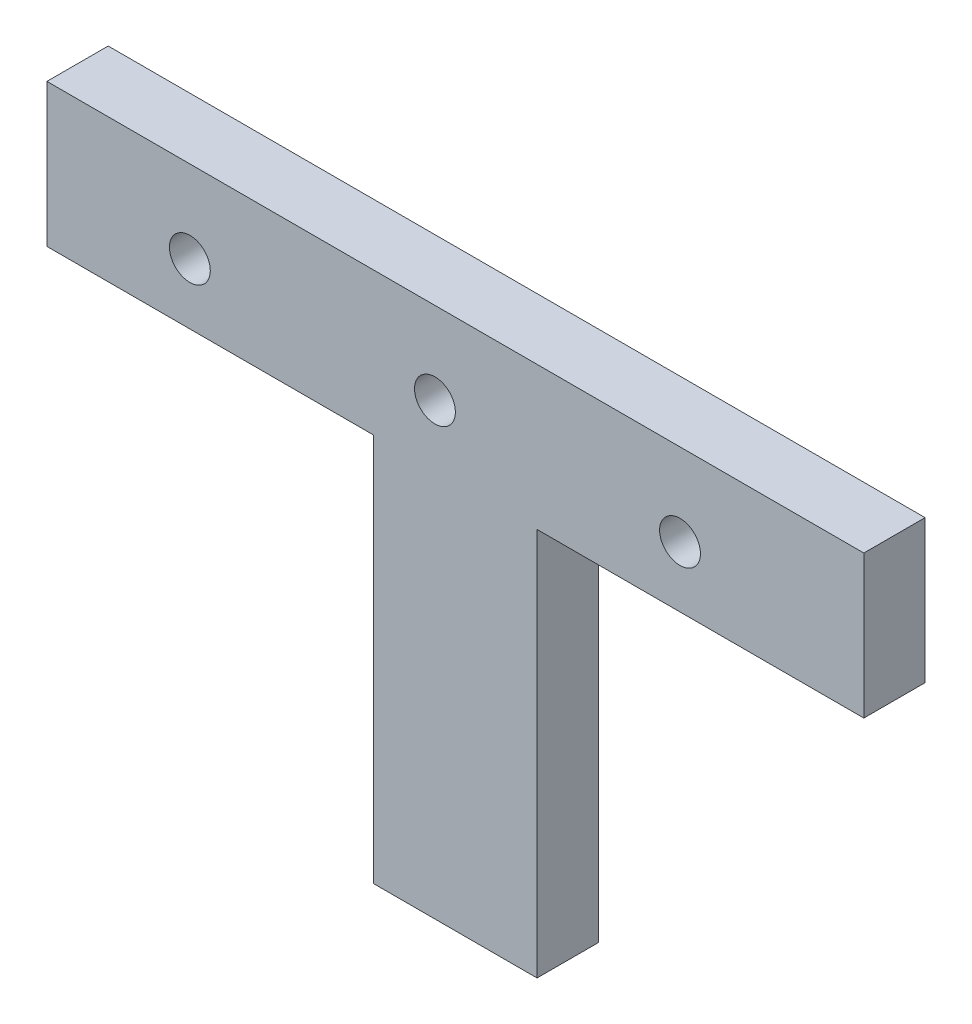
ISO-10303-21;
HEADER;
FILE_DESCRIPTION(('STEP AP214'),'2;1');
FILE_NAME('part.step','',(''),(''),'','','');
FILE_SCHEMA(('AUTOMOTIVE_DESIGN { 1 0 10303 214 1 1 1 1 }'));
ENDSEC;
DATA;
#1=APPLICATION_CONTEXT('core data for automotive mechanical design processes');
#2=APPLICATION_PROTOCOL_DEFINITION('international standard','automotive_design',2000,#1);
#3=PRODUCT_CONTEXT('',#1,'mechanical');
#4=PRODUCT('Part','Part','',(#3));
#5=PRODUCT_RELATED_PRODUCT_CATEGORY('part','',(#4));
#6=PRODUCT_DEFINITION_FORMATION('','',#4);
#7=PRODUCT_DEFINITION_CONTEXT('part definition',#1,'design');
#8=PRODUCT_DEFINITION('design','',#6,#7);
#9=PRODUCT_DEFINITION_SHAPE('','',#8);
#10=(LENGTH_UNIT() NAMED_UNIT(*) SI_UNIT(.MILLI.,.METRE.));
#11=(NAMED_UNIT(*) PLANE_ANGLE_UNIT() SI_UNIT($,.RADIAN.));
#12=(NAMED_UNIT(*) SI_UNIT($,.STERADIAN.) SOLID_ANGLE_UNIT());
#13=UNCERTAINTY_MEASURE_WITH_UNIT(LENGTH_MEASURE(1.E-05),#10,'distance_accuracy_value','');
#14=(GEOMETRIC_REPRESENTATION_CONTEXT(3) GLOBAL_UNCERTAINTY_ASSIGNED_CONTEXT((#13)) GLOBAL_UNIT_ASSIGNED_CONTEXT((#10,
#11,#12)) REPRESENTATION_CONTEXT('',''));
#15=CARTESIAN_POINT('',(0.,0.,0.));
#16=DIRECTION('',(0.,0.,1.));
#17=DIRECTION('',(1.,0.,0.));
#18=AXIS2_PLACEMENT_3D('',#15,#16,#17);
#19=CARTESIAN_POINT('',(-40.1551410613988,102.329702578108,15.));
#20=DIRECTION('',(-1.,0.,0.));
#21=DIRECTION('',(0.,-1.,0.));
#22=AXIS2_PLACEMENT_3D('',#19,#20,#21);
#23=PLANE('',#22);
#24=DIRECTION('',(0.,1.,0.));
#25=VECTOR('',#24,1.);
#26=CARTESIAN_POINT('',(-40.1551410613988,102.329702578108,0.));
#27=LINE('',#26,#25);
#28=CARTESIAN_POINT('',(-40.1551410613988,7.21961406259204,0.));
#29=VERTEX_POINT('',#28);
#30=CARTESIAN_POINT('',(-40.1551410613988,102.329702578108,0.));
#31=VERTEX_POINT('',#30);
#32=EDGE_CURVE('E129',#29,#31,#27,.T.);
#33=ORIENTED_EDGE('',*,*,#32,.T.);
#34=DIRECTION('',(0.,0.,-1.));
#35=VECTOR('',#34,1.);
#36=CARTESIAN_POINT('',(-40.1551410613988,102.329702578108,15.));
#37=LINE('',#36,#35);
#38=CARTESIAN_POINT('',(-40.1551410613988,102.329702578108,15.));
#39=VERTEX_POINT('',#38);
#40=EDGE_CURVE('E11',#39,#31,#37,.T.);
#41=ORIENTED_EDGE('',*,*,#40,.F.);
#42=DIRECTION('',(0.,1.,0.));
#43=VECTOR('',#42,1.);
#44=CARTESIAN_POINT('',(-40.1551410613988,102.329702578108,15.));
#45=LINE('',#44,#43);
#46=CARTESIAN_POINT('',(-40.1551410613988,7.21961406259204,15.));
#47=VERTEX_POINT('',#46);
#48=EDGE_CURVE('E144',#47,#39,#45,.T.);
#49=ORIENTED_EDGE('',*,*,#48,.F.);
#50=DIRECTION('',(0.,0.,-1.));
#51=VECTOR('',#50,1.);
#52=CARTESIAN_POINT('',(-40.1551410613988,7.21961406259204,15.));
#53=LINE('',#52,#51);
#54=EDGE_CURVE('E125',#47,#29,#53,.T.);
#55=ORIENTED_EDGE('',*,*,#54,.T.);
#56=EDGE_LOOP('',(#33,#41,#49,#55));
#57=FACE_BOUND('',#56,.T.);
#58=ADVANCED_FACE('F33',(#57),#23,.F.);
#59=CARTESIAN_POINT('',(39.8448589386012,102.329702578108,15.));
#60=DIRECTION('',(0.,1.,0.));
#61=DIRECTION('',(-1.,0.,0.));
#62=AXIS2_PLACEMENT_3D('',#59,#60,#61);
#63=PLANE('',#62);
#64=DIRECTION('',(1.,0.,0.));
#65=VECTOR('',#64,1.);
#66=CARTESIAN_POINT('',(39.8448589386012,102.329702578108,0.));
#67=LINE('',#66,#65);
#68=CARTESIAN_POINT('',(39.8448589386012,102.329702578108,0.));
#69=VERTEX_POINT('',#68);
#70=EDGE_CURVE('E132',#31,#69,#67,.T.);
#71=ORIENTED_EDGE('',*,*,#70,.T.);
#72=DIRECTION('',(0.,0.,-1.));
#73=VECTOR('',#72,1.);
#74=CARTESIAN_POINT('',(39.8448589386012,102.329702578108,15.));
#75=LINE('',#74,#73);
#76=CARTESIAN_POINT('',(39.8448589386012,102.329702578108,15.));
#77=VERTEX_POINT('',#76);
#78=EDGE_CURVE('E41',#77,#69,#75,.T.);
#79=ORIENTED_EDGE('',*,*,#78,.F.);
#80=DIRECTION('',(1.,0.,0.));
#81=VECTOR('',#80,1.);
#82=CARTESIAN_POINT('',(39.8448589386012,102.329702578108,15.));
#83=LINE('',#82,#81);
#84=EDGE_CURVE('E92',#39,#77,#83,.T.);
#85=ORIENTED_EDGE('',*,*,#84,.F.);
#86=ORIENTED_EDGE('',*,*,#40,.T.);
#87=EDGE_LOOP('',(#71,#79,#85,#86));
#88=FACE_BOUND('',#87,.T.);
#89=ADVANCED_FACE('F225',(#88),#63,.F.);
#90=CARTESIAN_POINT('',(39.8448589386012,137.329702578108,15.));
#91=DIRECTION('',(-1.,0.,0.));
#92=DIRECTION('',(0.,-1.,0.));
#93=AXIS2_PLACEMENT_3D('',#90,#91,#92);
#94=PLANE('',#93);
#95=DIRECTION('',(0.,1.,0.));
#96=VECTOR('',#95,1.);
#97=CARTESIAN_POINT('',(39.8448589386012,137.329702578108,0.));
#98=LINE('',#97,#96);
#99=CARTESIAN_POINT('',(39.8448589386012,137.329702578108,0.));
#100=VERTEX_POINT('',#99);
#101=EDGE_CURVE('E135',#69,#100,#98,.T.);
#102=ORIENTED_EDGE('',*,*,#101,.T.);
#103=DIRECTION('',(0.,0.,-1.));
#104=VECTOR('',#103,1.);
#105=CARTESIAN_POINT('',(39.8448589386012,137.329702578108,15.));
#106=LINE('',#105,#104);
#107=CARTESIAN_POINT('',(39.8448589386012,137.329702578108,15.));
#108=VERTEX_POINT('',#107);
#109=EDGE_CURVE('E151',#108,#100,#106,.T.);
#110=ORIENTED_EDGE('',*,*,#109,.F.);
#111=DIRECTION('',(0.,1.,0.));
#112=VECTOR('',#111,1.);
#113=CARTESIAN_POINT('',(39.8448589386012,137.329702578108,15.));
#114=LINE('',#113,#112);
#115=EDGE_CURVE('E159',#77,#108,#114,.T.);
#116=ORIENTED_EDGE('',*,*,#115,.F.);
#117=ORIENTED_EDGE('',*,*,#78,.T.);
#118=EDGE_LOOP('',(#102,#110,#116,#117));
#119=FACE_BOUND('',#118,.T.);
#120=ADVANCED_FACE('F157',(#119),#94,.F.);
#121=CARTESIAN_POINT('',(-160.155141061399,137.329702578108,15.));
#122=DIRECTION('',(0.,-1.,0.));
#123=DIRECTION('',(0.,0.,-1.));
#124=AXIS2_PLACEMENT_3D('',#121,#122,#123);
#125=PLANE('',#124);
#126=DIRECTION('',(-1.,0.,0.));
#127=VECTOR('',#126,1.);
#128=CARTESIAN_POINT('',(-160.155141061399,137.329702578108,0.));
#129=LINE('',#128,#127);
#130=CARTESIAN_POINT('',(-160.155141061399,137.329702578108,0.));
#131=VERTEX_POINT('',#130);
#132=EDGE_CURVE('E137',#100,#131,#129,.T.);
#133=ORIENTED_EDGE('',*,*,#132,.T.);
#134=DIRECTION('',(0.,0.,-1.));
#135=VECTOR('',#134,1.);
#136=CARTESIAN_POINT('',(-160.155141061399,137.329702578108,15.));
#137=LINE('',#136,#135);
#138=CARTESIAN_POINT('',(-160.155141061399,137.329702578108,15.));
#139=VERTEX_POINT('',#138);
#140=EDGE_CURVE('E148',#139,#131,#137,.T.);
#141=ORIENTED_EDGE('',*,*,#140,.F.);
#142=DIRECTION('',(-1.,0.,0.));
#143=VECTOR('',#142,1.);
#144=CARTESIAN_POINT('',(-160.155141061399,137.329702578108,15.));
#145=LINE('',#144,#143);
#146=EDGE_CURVE('E171',#108,#139,#145,.T.);
#147=ORIENTED_EDGE('',*,*,#146,.F.);
#148=ORIENTED_EDGE('',*,*,#109,.T.);
#149=EDGE_LOOP('',(#133,#141,#147,#148));
#150=FACE_BOUND('',#149,.T.);
#151=ADVANCED_FACE('F167',(#150),#125,.F.);
#152=CARTESIAN_POINT('',(-160.155141061399,102.329702578108,15.));
#153=DIRECTION('',(1.,0.,0.));
#154=DIRECTION('',(0.,1.,0.));
#155=AXIS2_PLACEMENT_3D('',#152,#153,#154);
#156=PLANE('',#155);
#157=DIRECTION('',(0.,-1.,0.));
#158=VECTOR('',#157,1.);
#159=CARTESIAN_POINT('',(-160.155141061399,102.329702578108,0.));
#160=LINE('',#159,#158);
#161=CARTESIAN_POINT('',(-160.155141061399,102.329702578108,0.));
#162=VERTEX_POINT('',#161);
#163=EDGE_CURVE('E139',#131,#162,#160,.T.);
#164=ORIENTED_EDGE('',*,*,#163,.T.);
#165=DIRECTION('',(0.,0.,-1.));
#166=VECTOR('',#165,1.);
#167=CARTESIAN_POINT('',(-160.155141061399,102.329702578108,15.));
#168=LINE('',#167,#166);
#169=CARTESIAN_POINT('',(-160.155141061399,102.329702578108,15.));
#170=VERTEX_POINT('',#169);
#171=EDGE_CURVE('E120',#170,#162,#168,.T.);
#172=ORIENTED_EDGE('',*,*,#171,.F.);
#173=DIRECTION('',(0.,-1.,0.));
#174=VECTOR('',#173,1.);
#175=CARTESIAN_POINT('',(-160.155141061399,102.329702578108,15.));
#176=LINE('',#175,#174);
#177=EDGE_CURVE('E111',#139,#170,#176,.T.);
#178=ORIENTED_EDGE('',*,*,#177,.F.);
#179=ORIENTED_EDGE('',*,*,#140,.T.);
#180=EDGE_LOOP('',(#164,#172,#178,#179));
#181=FACE_BOUND('',#180,.T.);
#182=ADVANCED_FACE('F170',(#181),#156,.F.);
#183=CARTESIAN_POINT('',(-80.1551410613988,102.329702578108,15.));
#184=DIRECTION('',(0.,1.,0.));
#185=DIRECTION('',(-1.,0.,0.));
#186=AXIS2_PLACEMENT_3D('',#183,#184,#185);
#187=PLANE('',#186);
#188=DIRECTION('',(1.,0.,0.));
#189=VECTOR('',#188,1.);
#190=CARTESIAN_POINT('',(-80.1551410613988,102.329702578108,0.));
#191=LINE('',#190,#189);
#192=CARTESIAN_POINT('',(-80.1551410613988,102.329702578108,0.));
#193=VERTEX_POINT('',#192);
#194=EDGE_CURVE('E119',#162,#193,#191,.T.);
#195=ORIENTED_EDGE('',*,*,#194,.T.);
#196=DIRECTION('',(0.,0.,-1.));
#197=VECTOR('',#196,1.);
#198=CARTESIAN_POINT('',(-80.1551410613988,102.329702578108,15.));
#199=LINE('',#198,#197);
#200=CARTESIAN_POINT('',(-80.1551410613988,102.329702578108,15.));
#201=VERTEX_POINT('',#200);
#202=EDGE_CURVE('E116',#201,#193,#199,.T.);
#203=ORIENTED_EDGE('',*,*,#202,.F.);
#204=DIRECTION('',(1.,0.,0.));
#205=VECTOR('',#204,1.);
#206=CARTESIAN_POINT('',(-80.1551410613988,102.329702578108,15.));
#207=LINE('',#206,#205);
#208=EDGE_CURVE('E105',#170,#201,#207,.T.);
#209=ORIENTED_EDGE('',*,*,#208,.F.);
#210=ORIENTED_EDGE('',*,*,#171,.T.);
#211=EDGE_LOOP('',(#195,#203,#209,#210));
#212=FACE_BOUND('',#211,.T.);
#213=ADVANCED_FACE('F117',(#212),#187,.F.);
#214=CARTESIAN_POINT('',(-80.1551410613988,7.21961406259203,15.));
#215=DIRECTION('',(1.,0.,0.));
#216=DIRECTION('',(0.,0.,-1.));
#217=AXIS2_PLACEMENT_3D('',#214,#215,#216);
#218=PLANE('',#217);
#219=DIRECTION('',(0.,-1.,0.));
#220=VECTOR('',#219,1.);
#221=CARTESIAN_POINT('',(-80.1551410613988,7.21961406259203,0.));
#222=LINE('',#221,#220);
#223=CARTESIAN_POINT('',(-80.1551410613988,7.21961406259203,0.));
#224=VERTEX_POINT('',#223);
#225=EDGE_CURVE('E78',#193,#224,#222,.T.);
#226=ORIENTED_EDGE('',*,*,#225,.T.);
#227=DIRECTION('',(0.,0.,-1.));
#228=VECTOR('',#227,1.);
#229=CARTESIAN_POINT('',(-80.1551410613988,7.21961406259203,15.));
#230=LINE('',#229,#228);
#231=CARTESIAN_POINT('',(-80.1551410613988,7.21961406259203,15.));
#232=VERTEX_POINT('',#231);
#233=EDGE_CURVE('E121',#232,#224,#230,.T.);
#234=ORIENTED_EDGE('',*,*,#233,.F.);
#235=DIRECTION('',(0.,-1.,0.));
#236=VECTOR('',#235,1.);
#237=CARTESIAN_POINT('',(-80.1551410613988,7.21961406259203,15.));
#238=LINE('',#237,#236);
#239=EDGE_CURVE('E109',#201,#232,#238,.T.);
#240=ORIENTED_EDGE('',*,*,#239,.F.);
#241=ORIENTED_EDGE('',*,*,#202,.T.);
#242=EDGE_LOOP('',(#226,#234,#240,#241));
#243=FACE_BOUND('',#242,.T.);
#244=ADVANCED_FACE('F123',(#243),#218,.F.);
#245=CARTESIAN_POINT('',(-40.1551410613988,7.21961406259204,15.));
#246=DIRECTION('',(0.,1.,0.));
#247=DIRECTION('',(-1.,0.,0.));
#248=AXIS2_PLACEMENT_3D('',#245,#246,#247);
#249=PLANE('',#248);
#250=DIRECTION('',(1.,0.,0.));
#251=VECTOR('',#250,1.);
#252=CARTESIAN_POINT('',(-40.1551410613988,7.21961406259204,0.));
#253=LINE('',#252,#251);
#254=EDGE_CURVE('E84',#224,#29,#253,.T.);
#255=ORIENTED_EDGE('',*,*,#254,.T.);
#256=ORIENTED_EDGE('',*,*,#54,.F.);
#257=DIRECTION('',(1.,0.,0.));
#258=VECTOR('',#257,1.);
#259=CARTESIAN_POINT('',(-40.1551410613988,7.21961406259204,15.));
#260=LINE('',#259,#258);
#261=EDGE_CURVE('E49',#232,#47,#260,.T.);
#262=ORIENTED_EDGE('',*,*,#261,.F.);
#263=ORIENTED_EDGE('',*,*,#233,.T.);
#264=EDGE_LOOP('',(#255,#256,#262,#263));
#265=FACE_BOUND('',#264,.T.);
#266=ADVANCED_FACE('F206',(#265),#249,.F.);
#267=CARTESIAN_POINT('',(0.,0.,15.));
#268=DIRECTION('',(0.,0.,-1.));
#269=DIRECTION('',(-1.,0.,0.));
#270=AXIS2_PLACEMENT_3D('',#267,#268,#269);
#271=PLANE('',#270);
#272=CARTESIAN_POINT('',(-5.15514106139883,117.189491535266,15.));
#273=DIRECTION('',(0.,0.,1.));
#274=DIRECTION('',(1.,0.,0.));
#275=AXIS2_PLACEMENT_3D('',#272,#273,#274);
#276=CIRCLE('',#275,5.00000000000001);
#277=CARTESIAN_POINT('',(-0.155141061398819,117.189491535266,15.));
#278=VERTEX_POINT('',#277);
#279=EDGE_CURVE('E189',#278,#278,#276,.T.);
#280=ORIENTED_EDGE('',*,*,#279,.F.);
#281=EDGE_LOOP('',(#280));
#282=FACE_BOUND('',#281,.T.);
#283=CARTESIAN_POINT('',(-65.1551410613988,117.189491535266,15.));
#284=DIRECTION('',(0.,0.,1.));
#285=DIRECTION('',(1.,0.,0.));
#286=AXIS2_PLACEMENT_3D('',#283,#284,#285);
#287=CIRCLE('',#286,5.00000000000001);
#288=CARTESIAN_POINT('',(-60.1551410613988,117.189491535266,15.));
#289=VERTEX_POINT('',#288);
#290=EDGE_CURVE('E183',#289,#289,#287,.T.);
#291=ORIENTED_EDGE('',*,*,#290,.F.);
#292=EDGE_LOOP('',(#291));
#293=FACE_BOUND('',#292,.T.);
#294=CARTESIAN_POINT('',(-125.155141061399,117.189491535266,15.));
#295=DIRECTION('',(0.,0.,1.));
#296=DIRECTION('',(1.,0.,0.));
#297=AXIS2_PLACEMENT_3D('',#294,#295,#296);
#298=CIRCLE('',#297,4.99999999999999);
#299=CARTESIAN_POINT('',(-120.155141061399,117.189491535266,15.));
#300=VERTEX_POINT('',#299);
#301=EDGE_CURVE('E177',#300,#300,#298,.T.);
#302=ORIENTED_EDGE('',*,*,#301,.F.);
#303=EDGE_LOOP('',(#302));
#304=FACE_BOUND('',#303,.T.);
#305=ORIENTED_EDGE('',*,*,#48,.T.);
#306=ORIENTED_EDGE('',*,*,#84,.T.);
#307=ORIENTED_EDGE('',*,*,#115,.T.);
#308=ORIENTED_EDGE('',*,*,#146,.T.);
#309=ORIENTED_EDGE('',*,*,#177,.T.);
#310=ORIENTED_EDGE('',*,*,#208,.T.);
#311=ORIENTED_EDGE('',*,*,#239,.T.);
#312=ORIENTED_EDGE('',*,*,#261,.T.);
#313=EDGE_LOOP('',(#305,#306,#307,#308,#309,#310,#311,#312));
#314=FACE_BOUND('',#313,.T.);
#315=ADVANCED_FACE('F107',(#282,#293,#304,#314),#271,.F.);
#316=CARTESIAN_POINT('',(0.,0.,0.));
#317=DIRECTION('',(0.,0.,-1.));
#318=DIRECTION('',(-1.,0.,0.));
#319=AXIS2_PLACEMENT_3D('',#316,#317,#318);
#320=PLANE('',#319);
#321=CARTESIAN_POINT('',(-5.15514106139883,117.189491535266,0.));
#322=DIRECTION('',(0.,0.,1.));
#323=DIRECTION('',(1.,0.,0.));
#324=AXIS2_PLACEMENT_3D('',#321,#322,#323);
#325=CIRCLE('',#324,5.00000000000001);
#326=CARTESIAN_POINT('',(-0.155141061398819,117.189491535266,0.));
#327=VERTEX_POINT('',#326);
#328=EDGE_CURVE('E133',#327,#327,#325,.T.);
#329=ORIENTED_EDGE('',*,*,#328,.T.);
#330=EDGE_LOOP('',(#329));
#331=FACE_BOUND('',#330,.T.);
#332=CARTESIAN_POINT('',(-65.1551410613988,117.189491535266,0.));
#333=DIRECTION('',(0.,0.,1.));
#334=DIRECTION('',(1.,0.,0.));
#335=AXIS2_PLACEMENT_3D('',#332,#333,#334);
#336=CIRCLE('',#335,5.00000000000001);
#337=CARTESIAN_POINT('',(-60.1551410613988,117.189491535266,0.));
#338=VERTEX_POINT('',#337);
#339=EDGE_CURVE('E186',#338,#338,#336,.T.);
#340=ORIENTED_EDGE('',*,*,#339,.T.);
#341=EDGE_LOOP('',(#340));
#342=FACE_BOUND('',#341,.T.);
#343=CARTESIAN_POINT('',(-125.155141061399,117.189491535266,0.));
#344=DIRECTION('',(0.,0.,1.));
#345=DIRECTION('',(1.,0.,0.));
#346=AXIS2_PLACEMENT_3D('',#343,#344,#345);
#347=CIRCLE('',#346,4.99999999999999);
#348=CARTESIAN_POINT('',(-120.155141061399,117.189491535266,0.));
#349=VERTEX_POINT('',#348);
#350=EDGE_CURVE('E180',#349,#349,#347,.T.);
#351=ORIENTED_EDGE('',*,*,#350,.T.);
#352=EDGE_LOOP('',(#351));
#353=FACE_BOUND('',#352,.T.);
#354=ORIENTED_EDGE('',*,*,#32,.F.);
#355=ORIENTED_EDGE('',*,*,#254,.F.);
#356=ORIENTED_EDGE('',*,*,#225,.F.);
#357=ORIENTED_EDGE('',*,*,#194,.F.);
#358=ORIENTED_EDGE('',*,*,#163,.F.);
#359=ORIENTED_EDGE('',*,*,#132,.F.);
#360=ORIENTED_EDGE('',*,*,#101,.F.);
#361=ORIENTED_EDGE('',*,*,#70,.F.);
#362=EDGE_LOOP('',(#354,#355,#356,#357,#358,#359,#360,#361));
#363=FACE_BOUND('',#362,.T.);
#364=ADVANCED_FACE('F163',(#331,#342,#353,#363),#320,.T.);
#365=CARTESIAN_POINT('',(-125.155141061399,117.189491535266,0.));
#366=DIRECTION('',(0.,0.,1.));
#367=DIRECTION('',(1.,0.,0.));
#368=AXIS2_PLACEMENT_3D('',#365,#366,#367);
#369=CYLINDRICAL_SURFACE('',#368,4.99999999999999);
#370=ORIENTED_EDGE('',*,*,#350,.F.);
#371=EDGE_LOOP('',(#370));
#372=FACE_BOUND('',#371,.T.);
#373=ORIENTED_EDGE('',*,*,#301,.T.);
#374=EDGE_LOOP('',(#373));
#375=FACE_BOUND('',#374,.T.);
#376=ADVANCED_FACE('F212',(#372,#375),#369,.F.);
#377=CARTESIAN_POINT('',(-65.1551410613988,117.189491535266,0.));
#378=DIRECTION('',(0.,0.,1.));
#379=DIRECTION('',(1.,0.,0.));
#380=AXIS2_PLACEMENT_3D('',#377,#378,#379);
#381=CYLINDRICAL_SURFACE('',#380,5.00000000000001);
#382=ORIENTED_EDGE('',*,*,#339,.F.);
#383=EDGE_LOOP('',(#382));
#384=FACE_BOUND('',#383,.T.);
#385=ORIENTED_EDGE('',*,*,#290,.T.);
#386=EDGE_LOOP('',(#385));
#387=FACE_BOUND('',#386,.T.);
#388=ADVANCED_FACE('F200',(#384,#387),#381,.F.);
#389=CARTESIAN_POINT('',(-5.15514106139883,117.189491535266,0.));
#390=DIRECTION('',(0.,0.,1.));
#391=DIRECTION('',(1.,0.,0.));
#392=AXIS2_PLACEMENT_3D('',#389,#390,#391);
#393=CYLINDRICAL_SURFACE('',#392,5.00000000000001);
#394=ORIENTED_EDGE('',*,*,#328,.F.);
#395=EDGE_LOOP('',(#394));
#396=FACE_BOUND('',#395,.T.);
#397=ORIENTED_EDGE('',*,*,#279,.T.);
#398=EDGE_LOOP('',(#397));
#399=FACE_BOUND('',#398,.T.);
#400=ADVANCED_FACE('F197',(#396,#399),#393,.F.);
#401=CLOSED_SHELL('',(#58,#89,#120,#151,#182,#213,#244,#266,#315,#364,#376,#388,#400));
#402=MANIFOLD_SOLID_BREP('B2',#401);
#403=ADVANCED_BREP_SHAPE_REPRESENTATION('',(#18,#402),#14);
#404=SHAPE_DEFINITION_REPRESENTATION(#9,#403);
ENDSEC;
END-ISO-10303-21;
